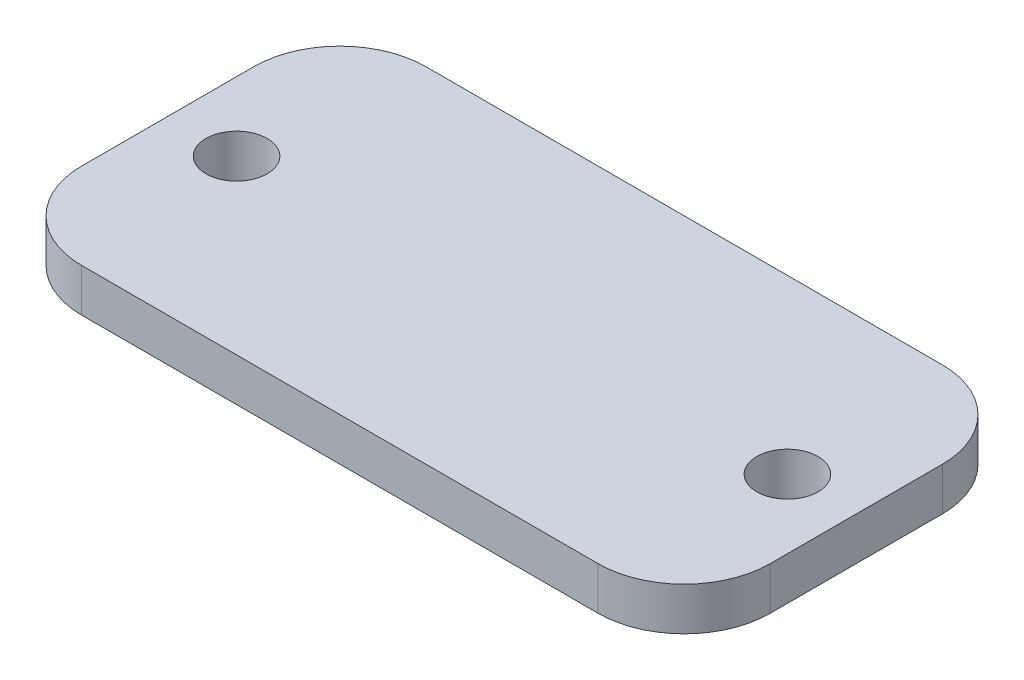
ISO-10303-21;
HEADER;
FILE_DESCRIPTION(('STEP AP214'),'2;1');
FILE_NAME('part.step','',(''),(''),'','','');
FILE_SCHEMA(('AUTOMOTIVE_DESIGN { 1 0 10303 214 1 1 1 1 }'));
ENDSEC;
DATA;
#1=APPLICATION_CONTEXT('core data for automotive mechanical design processes');
#2=APPLICATION_PROTOCOL_DEFINITION('international standard','automotive_design',2000,#1);
#3=PRODUCT_CONTEXT('',#1,'mechanical');
#4=PRODUCT('Part','Part','',(#3));
#5=PRODUCT_RELATED_PRODUCT_CATEGORY('part','',(#4));
#6=PRODUCT_DEFINITION_FORMATION('','',#4);
#7=PRODUCT_DEFINITION_CONTEXT('part definition',#1,'design');
#8=PRODUCT_DEFINITION('design','',#6,#7);
#9=PRODUCT_DEFINITION_SHAPE('','',#8);
#10=(LENGTH_UNIT() NAMED_UNIT(*) SI_UNIT(.MILLI.,.METRE.));
#11=(NAMED_UNIT(*) PLANE_ANGLE_UNIT() SI_UNIT($,.RADIAN.));
#12=(NAMED_UNIT(*) SI_UNIT($,.STERADIAN.) SOLID_ANGLE_UNIT());
#13=UNCERTAINTY_MEASURE_WITH_UNIT(LENGTH_MEASURE(1.E-05),#10,'distance_accuracy_value','');
#14=(GEOMETRIC_REPRESENTATION_CONTEXT(3) GLOBAL_UNCERTAINTY_ASSIGNED_CONTEXT((#13)) GLOBAL_UNIT_ASSIGNED_CONTEXT((#10,
#11,#12)) REPRESENTATION_CONTEXT('',''));
#15=CARTESIAN_POINT('',(0.,0.,0.));
#16=DIRECTION('',(0.,0.,1.));
#17=DIRECTION('',(1.,0.,0.));
#18=AXIS2_PLACEMENT_3D('',#15,#16,#17);
#19=CARTESIAN_POINT('',(0.,1.5875,0.));
#20=DIRECTION('',(1.,0.,0.));
#21=DIRECTION('',(0.,0.,-1.));
#22=AXIS2_PLACEMENT_3D('',#19,#20,#21);
#23=PLANE('',#22);
#24=DIRECTION('',(0.,0.,1.));
#25=VECTOR('',#24,1.);
#26=CARTESIAN_POINT('',(0.,1.5875,0.));
#27=LINE('',#26,#25);
#28=CARTESIAN_POINT('',(0.,1.5875,-9.525));
#29=VERTEX_POINT('',#28);
#30=CARTESIAN_POINT('',(0.,1.5875,-3.175));
#31=VERTEX_POINT('',#30);
#32=EDGE_CURVE('E128',#29,#31,#27,.T.);
#33=ORIENTED_EDGE('',*,*,#32,.F.);
#34=DIRECTION('',(0.,-1.,0.));
#35=VECTOR('',#34,1.);
#36=CARTESIAN_POINT('',(0.,1.5875,-9.525));
#37=LINE('',#36,#35);
#38=CARTESIAN_POINT('',(0.,0.,-9.525));
#39=VERTEX_POINT('',#38);
#40=EDGE_CURVE('E11',#29,#39,#37,.T.);
#41=ORIENTED_EDGE('',*,*,#40,.T.);
#42=DIRECTION('',(0.,0.,1.));
#43=VECTOR('',#42,1.);
#44=CARTESIAN_POINT('',(0.,0.,0.));
#45=LINE('',#44,#43);
#46=CARTESIAN_POINT('',(0.,0.,-3.175));
#47=VERTEX_POINT('',#46);
#48=EDGE_CURVE('E130',#39,#47,#45,.T.);
#49=ORIENTED_EDGE('',*,*,#48,.T.);
#50=DIRECTION('',(0.,-1.,0.));
#51=VECTOR('',#50,1.);
#52=CARTESIAN_POINT('',(0.,1.5875,-3.175));
#53=LINE('',#52,#51);
#54=EDGE_CURVE('E41',#47,#31,#53,.F.);
#55=ORIENTED_EDGE('',*,*,#54,.T.);
#56=EDGE_LOOP('',(#33,#41,#49,#55));
#57=FACE_BOUND('',#56,.T.);
#58=ADVANCED_FACE('F33',(#57),#23,.F.);
#59=CARTESIAN_POINT('',(0.,1.5875,0.));
#60=DIRECTION('',(0.,0.,-1.));
#61=DIRECTION('',(-1.,0.,0.));
#62=AXIS2_PLACEMENT_3D('',#59,#60,#61);
#63=PLANE('',#62);
#64=DIRECTION('',(1.,0.,0.));
#65=VECTOR('',#64,1.);
#66=CARTESIAN_POINT('',(0.,0.,0.));
#67=LINE('',#66,#65);
#68=CARTESIAN_POINT('',(3.175,0.,0.));
#69=VERTEX_POINT('',#68);
#70=CARTESIAN_POINT('',(22.225,0.,0.));
#71=VERTEX_POINT('',#70);
#72=EDGE_CURVE('E126',#69,#71,#67,.T.);
#73=ORIENTED_EDGE('',*,*,#72,.T.);
#74=DIRECTION('',(0.,-1.,0.));
#75=VECTOR('',#74,1.);
#76=CARTESIAN_POINT('',(22.225,1.5875,0.));
#77=LINE('',#76,#75);
#78=CARTESIAN_POINT('',(22.225,1.5875,0.));
#79=VERTEX_POINT('',#78);
#80=EDGE_CURVE('E105',#71,#79,#77,.F.);
#81=ORIENTED_EDGE('',*,*,#80,.T.);
#82=DIRECTION('',(1.,0.,0.));
#83=VECTOR('',#82,1.);
#84=CARTESIAN_POINT('',(0.,1.5875,0.));
#85=LINE('',#84,#83);
#86=CARTESIAN_POINT('',(3.175,1.5875,0.));
#87=VERTEX_POINT('',#86);
#88=EDGE_CURVE('E166',#87,#79,#85,.T.);
#89=ORIENTED_EDGE('',*,*,#88,.F.);
#90=DIRECTION('',(0.,-1.,0.));
#91=VECTOR('',#90,1.);
#92=CARTESIAN_POINT('',(3.175,1.5875,0.));
#93=LINE('',#92,#91);
#94=EDGE_CURVE('E110',#87,#69,#93,.T.);
#95=ORIENTED_EDGE('',*,*,#94,.T.);
#96=EDGE_LOOP('',(#73,#81,#89,#95));
#97=FACE_BOUND('',#96,.T.);
#98=ADVANCED_FACE('F170',(#97),#63,.F.);
#99=CARTESIAN_POINT('',(25.4,1.5875,0.));
#100=DIRECTION('',(-1.,0.,0.));
#101=DIRECTION('',(0.,0.,1.));
#102=AXIS2_PLACEMENT_3D('',#99,#100,#101);
#103=PLANE('',#102);
#104=DIRECTION('',(0.,0.,-1.));
#105=VECTOR('',#104,1.);
#106=CARTESIAN_POINT('',(25.4,1.5875,0.));
#107=LINE('',#106,#105);
#108=CARTESIAN_POINT('',(25.4,1.5875,-3.175));
#109=VERTEX_POINT('',#108);
#110=CARTESIAN_POINT('',(25.4,1.5875,-9.525));
#111=VERTEX_POINT('',#110);
#112=EDGE_CURVE('E119',#109,#111,#107,.T.);
#113=ORIENTED_EDGE('',*,*,#112,.F.);
#114=DIRECTION('',(0.,-1.,0.));
#115=VECTOR('',#114,1.);
#116=CARTESIAN_POINT('',(25.4,1.5875,-3.175));
#117=LINE('',#116,#115);
#118=CARTESIAN_POINT('',(25.4,0.,-3.175));
#119=VERTEX_POINT('',#118);
#120=EDGE_CURVE('E104',#109,#119,#117,.T.);
#121=ORIENTED_EDGE('',*,*,#120,.T.);
#122=DIRECTION('',(0.,0.,-1.));
#123=VECTOR('',#122,1.);
#124=CARTESIAN_POINT('',(25.4,0.,0.));
#125=LINE('',#124,#123);
#126=CARTESIAN_POINT('',(25.4,0.,-9.525));
#127=VERTEX_POINT('',#126);
#128=EDGE_CURVE('E117',#119,#127,#125,.T.);
#129=ORIENTED_EDGE('',*,*,#128,.T.);
#130=DIRECTION('',(0.,-1.,0.));
#131=VECTOR('',#130,1.);
#132=CARTESIAN_POINT('',(25.4,1.5875,-9.525));
#133=LINE('',#132,#131);
#134=EDGE_CURVE('E121',#127,#111,#133,.F.);
#135=ORIENTED_EDGE('',*,*,#134,.T.);
#136=EDGE_LOOP('',(#113,#121,#129,#135));
#137=FACE_BOUND('',#136,.T.);
#138=ADVANCED_FACE('F116',(#137),#103,.F.);
#139=CARTESIAN_POINT('',(0.,1.5875,-12.7));
#140=DIRECTION('',(0.,0.,1.));
#141=DIRECTION('',(1.,0.,0.));
#142=AXIS2_PLACEMENT_3D('',#139,#140,#141);
#143=PLANE('',#142);
#144=DIRECTION('',(-1.,0.,0.));
#145=VECTOR('',#144,1.);
#146=CARTESIAN_POINT('',(0.,1.5875,-12.7));
#147=LINE('',#146,#145);
#148=CARTESIAN_POINT('',(22.225,1.5875,-12.7));
#149=VERTEX_POINT('',#148);
#150=CARTESIAN_POINT('',(3.175,1.5875,-12.7));
#151=VERTEX_POINT('',#150);
#152=EDGE_CURVE('E134',#149,#151,#147,.T.);
#153=ORIENTED_EDGE('',*,*,#152,.F.);
#154=DIRECTION('',(0.,-1.,0.));
#155=VECTOR('',#154,1.);
#156=CARTESIAN_POINT('',(22.225,1.5875,-12.7));
#157=LINE('',#156,#155);
#158=CARTESIAN_POINT('',(22.225,0.,-12.7));
#159=VERTEX_POINT('',#158);
#160=EDGE_CURVE('E151',#149,#159,#157,.T.);
#161=ORIENTED_EDGE('',*,*,#160,.T.);
#162=DIRECTION('',(-1.,0.,0.));
#163=VECTOR('',#162,1.);
#164=CARTESIAN_POINT('',(0.,0.,-12.7));
#165=LINE('',#164,#163);
#166=CARTESIAN_POINT('',(3.175,0.,-12.7));
#167=VERTEX_POINT('',#166);
#168=EDGE_CURVE('E125',#159,#167,#165,.T.);
#169=ORIENTED_EDGE('',*,*,#168,.T.);
#170=DIRECTION('',(0.,-1.,0.));
#171=VECTOR('',#170,1.);
#172=CARTESIAN_POINT('',(3.175,1.5875,-12.7));
#173=LINE('',#172,#171);
#174=EDGE_CURVE('E48',#167,#151,#173,.F.);
#175=ORIENTED_EDGE('',*,*,#174,.T.);
#176=EDGE_LOOP('',(#153,#161,#169,#175));
#177=FACE_BOUND('',#176,.T.);
#178=ADVANCED_FACE('F192',(#177),#143,.F.);
#179=CARTESIAN_POINT('',(0.,1.5875,0.));
#180=DIRECTION('',(0.,-1.,0.));
#181=DIRECTION('',(0.,0.,-1.));
#182=AXIS2_PLACEMENT_3D('',#179,#180,#181);
#183=PLANE('',#182);
#184=CARTESIAN_POINT('',(2.54,1.5875,-6.35));
#185=DIRECTION('',(0.,1.,0.));
#186=DIRECTION('',(0.,0.,1.));
#187=AXIS2_PLACEMENT_3D('',#184,#185,#186);
#188=CIRCLE('',#187,1.1303);
#189=CARTESIAN_POINT('',(2.54,1.5875,-5.2197));
#190=VERTEX_POINT('',#189);
#191=EDGE_CURVE('E173',#190,#190,#188,.T.);
#192=ORIENTED_EDGE('',*,*,#191,.F.);
#193=EDGE_LOOP('',(#192));
#194=FACE_BOUND('',#193,.T.);
#195=CARTESIAN_POINT('',(22.86,1.5875,-6.35));
#196=DIRECTION('',(0.,1.,0.));
#197=DIRECTION('',(0.,0.,-1.));
#198=AXIS2_PLACEMENT_3D('',#195,#196,#197);
#199=CIRCLE('',#198,1.1303);
#200=CARTESIAN_POINT('',(22.86,1.5875,-7.4803));
#201=VERTEX_POINT('',#200);
#202=EDGE_CURVE('E179',#201,#201,#199,.T.);
#203=ORIENTED_EDGE('',*,*,#202,.F.);
#204=EDGE_LOOP('',(#203));
#205=FACE_BOUND('',#204,.T.);
#206=ORIENTED_EDGE('',*,*,#88,.T.);
#207=CARTESIAN_POINT('',(22.225,1.5875,-3.175));
#208=DIRECTION('',(0.,-1.,0.));
#209=DIRECTION('',(0.,0.,-1.));
#210=AXIS2_PLACEMENT_3D('',#207,#208,#209);
#211=CIRCLE('',#210,3.175);
#212=EDGE_CURVE('E148',#79,#109,#211,.F.);
#213=ORIENTED_EDGE('',*,*,#212,.T.);
#214=ORIENTED_EDGE('',*,*,#112,.T.);
#215=CARTESIAN_POINT('',(22.225,1.5875,-9.525));
#216=DIRECTION('',(0.,-1.,0.));
#217=DIRECTION('',(0.,0.,-1.));
#218=AXIS2_PLACEMENT_3D('',#215,#216,#217);
#219=CIRCLE('',#218,3.175);
#220=EDGE_CURVE('E55',#111,#149,#219,.F.);
#221=ORIENTED_EDGE('',*,*,#220,.T.);
#222=ORIENTED_EDGE('',*,*,#152,.T.);
#223=CARTESIAN_POINT('',(3.175,1.5875,-9.525));
#224=DIRECTION('',(0.,-1.,0.));
#225=DIRECTION('',(0.,0.,-1.));
#226=AXIS2_PLACEMENT_3D('',#223,#224,#225);
#227=CIRCLE('',#226,3.175);
#228=EDGE_CURVE('E145',#151,#29,#227,.F.);
#229=ORIENTED_EDGE('',*,*,#228,.T.);
#230=ORIENTED_EDGE('',*,*,#32,.T.);
#231=CARTESIAN_POINT('',(3.175,1.5875,-3.175));
#232=DIRECTION('',(0.,-1.,0.));
#233=DIRECTION('',(0.,0.,-1.));
#234=AXIS2_PLACEMENT_3D('',#231,#232,#233);
#235=CIRCLE('',#234,3.175);
#236=EDGE_CURVE('E143',#31,#87,#235,.F.);
#237=ORIENTED_EDGE('',*,*,#236,.T.);
#238=EDGE_LOOP('',(#206,#213,#214,#221,#222,#229,#230,#237));
#239=FACE_BOUND('',#238,.T.);
#240=ADVANCED_FACE('F163',(#194,#205,#239),#183,.F.);
#241=CARTESIAN_POINT('',(0.,0.,0.));
#242=DIRECTION('',(0.,-1.,0.));
#243=DIRECTION('',(0.,0.,-1.));
#244=AXIS2_PLACEMENT_3D('',#241,#242,#243);
#245=PLANE('',#244);
#246=CARTESIAN_POINT('',(2.54,0.,-6.35));
#247=DIRECTION('',(0.,1.,0.));
#248=DIRECTION('',(0.,0.,1.));
#249=AXIS2_PLACEMENT_3D('',#246,#247,#248);
#250=CIRCLE('',#249,1.1303);
#251=CARTESIAN_POINT('',(2.54,0.,-5.2197));
#252=VERTEX_POINT('',#251);
#253=EDGE_CURVE('E171',#252,#252,#250,.T.);
#254=ORIENTED_EDGE('',*,*,#253,.T.);
#255=EDGE_LOOP('',(#254));
#256=FACE_BOUND('',#255,.T.);
#257=CARTESIAN_POINT('',(22.86,0.,-6.35));
#258=DIRECTION('',(0.,1.,0.));
#259=DIRECTION('',(0.,0.,-1.));
#260=AXIS2_PLACEMENT_3D('',#257,#258,#259);
#261=CIRCLE('',#260,1.1303);
#262=CARTESIAN_POINT('',(22.86,0.,-7.4803));
#263=VERTEX_POINT('',#262);
#264=EDGE_CURVE('E182',#263,#263,#261,.T.);
#265=ORIENTED_EDGE('',*,*,#264,.T.);
#266=EDGE_LOOP('',(#265));
#267=FACE_BOUND('',#266,.T.);
#268=ORIENTED_EDGE('',*,*,#128,.F.);
#269=CARTESIAN_POINT('',(22.225,0.,-3.175));
#270=DIRECTION('',(0.,-1.,0.));
#271=DIRECTION('',(0.,0.,-1.));
#272=AXIS2_PLACEMENT_3D('',#269,#270,#271);
#273=CIRCLE('',#272,3.175);
#274=EDGE_CURVE('E100',#119,#71,#273,.T.);
#275=ORIENTED_EDGE('',*,*,#274,.T.);
#276=ORIENTED_EDGE('',*,*,#72,.F.);
#277=CARTESIAN_POINT('',(3.175,0.,-3.175));
#278=DIRECTION('',(0.,-1.,0.));
#279=DIRECTION('',(0.,0.,-1.));
#280=AXIS2_PLACEMENT_3D('',#277,#278,#279);
#281=CIRCLE('',#280,3.175);
#282=EDGE_CURVE('E120',#69,#47,#281,.T.);
#283=ORIENTED_EDGE('',*,*,#282,.T.);
#284=ORIENTED_EDGE('',*,*,#48,.F.);
#285=CARTESIAN_POINT('',(3.175,0.,-9.525));
#286=DIRECTION('',(0.,-1.,0.));
#287=DIRECTION('',(0.,0.,-1.));
#288=AXIS2_PLACEMENT_3D('',#285,#286,#287);
#289=CIRCLE('',#288,3.175);
#290=EDGE_CURVE('E137',#39,#167,#289,.T.);
#291=ORIENTED_EDGE('',*,*,#290,.T.);
#292=ORIENTED_EDGE('',*,*,#168,.F.);
#293=CARTESIAN_POINT('',(22.225,0.,-9.525));
#294=DIRECTION('',(0.,-1.,0.));
#295=DIRECTION('',(0.,0.,-1.));
#296=AXIS2_PLACEMENT_3D('',#293,#294,#295);
#297=CIRCLE('',#296,3.175);
#298=EDGE_CURVE('E111',#159,#127,#297,.T.);
#299=ORIENTED_EDGE('',*,*,#298,.T.);
#300=EDGE_LOOP('',(#268,#275,#276,#283,#284,#291,#292,#299));
#301=FACE_BOUND('',#300,.T.);
#302=ADVANCED_FACE('F123',(#256,#267,#301),#245,.T.);
#303=CARTESIAN_POINT('',(22.225,1.5875,-3.175));
#304=DIRECTION('',(0.,-1.,0.));
#305=DIRECTION('',(0.,0.,-1.));
#306=AXIS2_PLACEMENT_3D('',#303,#304,#305);
#307=CYLINDRICAL_SURFACE('',#306,3.175);
#308=ORIENTED_EDGE('',*,*,#212,.F.);
#309=ORIENTED_EDGE('',*,*,#80,.F.);
#310=ORIENTED_EDGE('',*,*,#274,.F.);
#311=ORIENTED_EDGE('',*,*,#120,.F.);
#312=EDGE_LOOP('',(#308,#309,#310,#311));
#313=FACE_BOUND('',#312,.T.);
#314=ADVANCED_FACE('F103',(#313),#307,.T.);
#315=CARTESIAN_POINT('',(22.225,1.5875,-9.525));
#316=DIRECTION('',(0.,-1.,0.));
#317=DIRECTION('',(0.,0.,-1.));
#318=AXIS2_PLACEMENT_3D('',#315,#316,#317);
#319=CYLINDRICAL_SURFACE('',#318,3.175);
#320=ORIENTED_EDGE('',*,*,#220,.F.);
#321=ORIENTED_EDGE('',*,*,#134,.F.);
#322=ORIENTED_EDGE('',*,*,#298,.F.);
#323=ORIENTED_EDGE('',*,*,#160,.F.);
#324=EDGE_LOOP('',(#320,#321,#322,#323));
#325=FACE_BOUND('',#324,.T.);
#326=ADVANCED_FACE('F218',(#325),#319,.T.);
#327=CARTESIAN_POINT('',(3.175,1.5875,-9.525));
#328=DIRECTION('',(0.,-1.,0.));
#329=DIRECTION('',(0.,0.,-1.));
#330=AXIS2_PLACEMENT_3D('',#327,#328,#329);
#331=CYLINDRICAL_SURFACE('',#330,3.175);
#332=ORIENTED_EDGE('',*,*,#228,.F.);
#333=ORIENTED_EDGE('',*,*,#174,.F.);
#334=ORIENTED_EDGE('',*,*,#290,.F.);
#335=ORIENTED_EDGE('',*,*,#40,.F.);
#336=EDGE_LOOP('',(#332,#333,#334,#335));
#337=FACE_BOUND('',#336,.T.);
#338=ADVANCED_FACE('F206',(#337),#331,.T.);
#339=CARTESIAN_POINT('',(3.175,1.5875,-3.175));
#340=DIRECTION('',(0.,-1.,0.));
#341=DIRECTION('',(0.,0.,-1.));
#342=AXIS2_PLACEMENT_3D('',#339,#340,#341);
#343=CYLINDRICAL_SURFACE('',#342,3.175);
#344=ORIENTED_EDGE('',*,*,#236,.F.);
#345=ORIENTED_EDGE('',*,*,#54,.F.);
#346=ORIENTED_EDGE('',*,*,#282,.F.);
#347=ORIENTED_EDGE('',*,*,#94,.F.);
#348=EDGE_LOOP('',(#344,#345,#346,#347));
#349=FACE_BOUND('',#348,.T.);
#350=ADVANCED_FACE('F35',(#349),#343,.T.);
#351=CARTESIAN_POINT('',(22.86,0.,-6.35));
#352=DIRECTION('',(0.,1.,0.));
#353=DIRECTION('',(0.,0.,1.));
#354=AXIS2_PLACEMENT_3D('',#351,#352,#353);
#355=CYLINDRICAL_SURFACE('',#354,1.1303);
#356=ORIENTED_EDGE('',*,*,#264,.F.);
#357=EDGE_LOOP('',(#356));
#358=FACE_BOUND('',#357,.T.);
#359=ORIENTED_EDGE('',*,*,#202,.T.);
#360=EDGE_LOOP('',(#359));
#361=FACE_BOUND('',#360,.T.);
#362=ADVANCED_FACE('F196',(#358,#361),#355,.F.);
#363=CARTESIAN_POINT('',(2.54,0.,-6.35));
#364=DIRECTION('',(0.,1.,0.));
#365=DIRECTION('',(0.,0.,1.));
#366=AXIS2_PLACEMENT_3D('',#363,#364,#365);
#367=CYLINDRICAL_SURFACE('',#366,1.1303);
#368=ORIENTED_EDGE('',*,*,#253,.F.);
#369=EDGE_LOOP('',(#368));
#370=FACE_BOUND('',#369,.T.);
#371=ORIENTED_EDGE('',*,*,#191,.T.);
#372=EDGE_LOOP('',(#371));
#373=FACE_BOUND('',#372,.T.);
#374=ADVANCED_FACE('F188',(#370,#373),#367,.F.);
#375=CLOSED_SHELL('',(#58,#98,#138,#178,#240,#302,#314,#326,#338,#350,#362,#374));
#376=MANIFOLD_SOLID_BREP('B2',#375);
#377=ADVANCED_BREP_SHAPE_REPRESENTATION('',(#18,#376),#14);
#378=SHAPE_DEFINITION_REPRESENTATION(#9,#377);
ENDSEC;
END-ISO-10303-21;
